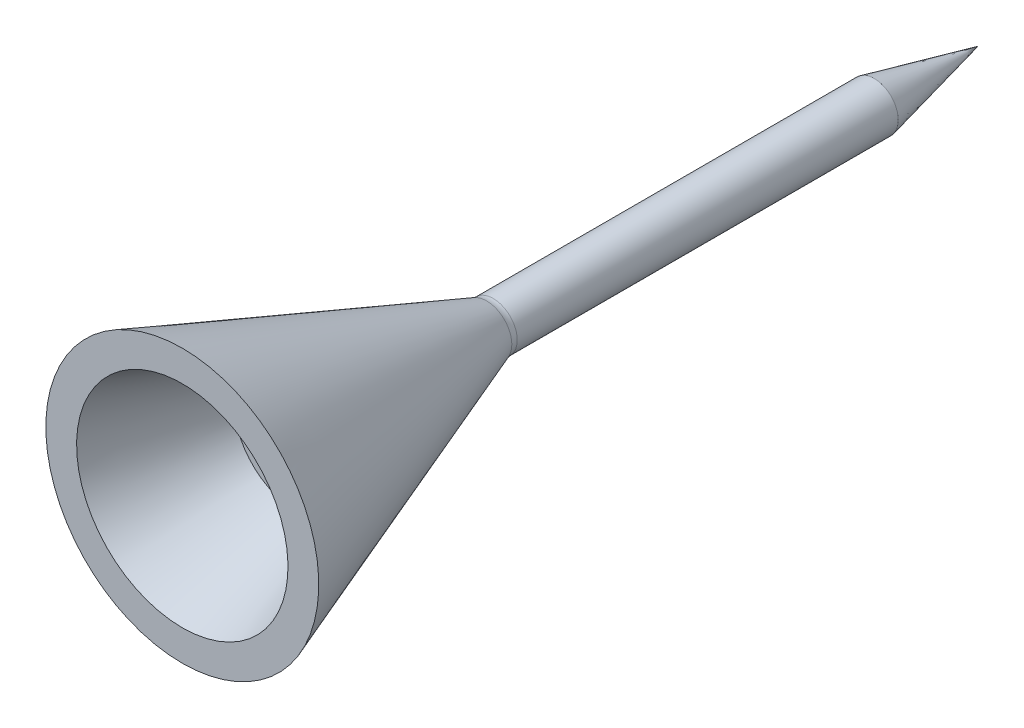
ISO-10303-21;
HEADER;
FILE_DESCRIPTION(('STEP AP214'),'2;1');
FILE_NAME('part.step','',(''),(''),'','','');
FILE_SCHEMA(('AUTOMOTIVE_DESIGN { 1 0 10303 214 1 1 1 1 }'));
ENDSEC;
DATA;
#1=APPLICATION_CONTEXT('core data for automotive mechanical design processes');
#2=APPLICATION_PROTOCOL_DEFINITION('international standard','automotive_design',2000,#1);
#3=PRODUCT_CONTEXT('',#1,'mechanical');
#4=PRODUCT('Part','Part','',(#3));
#5=PRODUCT_RELATED_PRODUCT_CATEGORY('part','',(#4));
#6=PRODUCT_DEFINITION_FORMATION('','',#4);
#7=PRODUCT_DEFINITION_CONTEXT('part definition',#1,'design');
#8=PRODUCT_DEFINITION('design','',#6,#7);
#9=PRODUCT_DEFINITION_SHAPE('','',#8);
#10=(LENGTH_UNIT() NAMED_UNIT(*) SI_UNIT(.MILLI.,.METRE.));
#11=(NAMED_UNIT(*) PLANE_ANGLE_UNIT() SI_UNIT($,.RADIAN.));
#12=(NAMED_UNIT(*) SI_UNIT($,.STERADIAN.) SOLID_ANGLE_UNIT());
#13=UNCERTAINTY_MEASURE_WITH_UNIT(LENGTH_MEASURE(1.E-05),#10,'distance_accuracy_value','');
#14=(GEOMETRIC_REPRESENTATION_CONTEXT(3) GLOBAL_UNCERTAINTY_ASSIGNED_CONTEXT((#13)) GLOBAL_UNIT_ASSIGNED_CONTEXT((#10,
#11,#12)) REPRESENTATION_CONTEXT('',''));
#15=CARTESIAN_POINT('',(0.,0.,0.));
#16=DIRECTION('',(0.,0.,1.));
#17=DIRECTION('',(1.,0.,0.));
#18=AXIS2_PLACEMENT_3D('',#15,#16,#17);
#19=CARTESIAN_POINT('',(0.,0.,10.));
#20=DIRECTION('',(0.,0.,-1.));
#21=DIRECTION('',(0.,1.,0.));
#22=AXIS2_PLACEMENT_3D('',#19,#20,#21);
#23=PLANE('',#22);
#24=CARTESIAN_POINT('',(0.,-1.25000000000001,10.));
#25=DIRECTION('',(0.,0.,1.));
#26=DIRECTION('',(0.,-1.,0.));
#27=AXIS2_PLACEMENT_3D('',#24,#25,#26);
#28=CIRCLE('',#27,3.30625);
#29=CARTESIAN_POINT('',(0.,-4.55625000000001,10.));
#30=VERTEX_POINT('',#29);
#31=EDGE_CURVE('E74',#30,#30,#28,.T.);
#32=ORIENTED_EDGE('',*,*,#31,.T.);
#33=EDGE_LOOP('',(#32));
#34=FACE_BOUND('',#33,.T.);
#35=ADVANCED_FACE('F41',(#34),#23,.F.);
#36=CARTESIAN_POINT('',(0.,-1.25,-20.));
#37=DIRECTION('',(0.,0.,1.));
#38=DIRECTION('',(0.,-1.,0.));
#39=AXIS2_PLACEMENT_3D('',#36,#37,#38);
#40=CONICAL_SURFACE('',#39,1.25,0.227474980472828);
#41=CARTESIAN_POINT('',(0.,-1.25,-25.4));
#42=VERTEX_POINT('',#41);
#43=VERTEX_LOOP('',#42);
#44=FACE_BOUND('',#43,.T.);
#45=CARTESIAN_POINT('',(0.,-1.25,-20.));
#46=DIRECTION('',(0.,0.,1.));
#47=DIRECTION('',(0.,-1.,0.));
#48=AXIS2_PLACEMENT_3D('',#45,#46,#47);
#49=CIRCLE('',#48,1.25);
#50=CARTESIAN_POINT('',(0.,-2.5,-20.));
#51=VERTEX_POINT('',#50);
#52=EDGE_CURVE('E59',#51,#51,#49,.T.);
#53=ORIENTED_EDGE('',*,*,#52,.F.);
#54=EDGE_LOOP('',(#53));
#55=FACE_BOUND('',#54,.T.);
#56=ADVANCED_FACE('F52',(#44,#55),#40,.T.);
#57=CARTESIAN_POINT('',(0.,-1.25000000000001,10.));
#58=DIRECTION('',(0.,0.,1.));
#59=DIRECTION('',(0.,-1.,0.));
#60=AXIS2_PLACEMENT_3D('',#57,#58,#59);
#61=CYLINDRICAL_SURFACE('',#60,1.25);
#62=CARTESIAN_POINT('',(0.,-1.25,-0.17707998945053));
#63=DIRECTION('',(0.,0.,1.));
#64=DIRECTION('',(0.,-1.,0.));
#65=AXIS2_PLACEMENT_3D('',#62,#63,#64);
#66=CIRCLE('',#65,1.25);
#67=CARTESIAN_POINT('',(0.,-2.50000000000001,-0.17707998945053));
#68=VERTEX_POINT('',#67);
#69=EDGE_CURVE('E11',#68,#68,#66,.F.);
#70=ORIENTED_EDGE('',*,*,#69,.T.);
#71=EDGE_LOOP('',(#70));
#72=FACE_BOUND('',#71,.T.);
#73=ORIENTED_EDGE('',*,*,#52,.T.);
#74=EDGE_LOOP('',(#73));
#75=FACE_BOUND('',#74,.T.);
#76=ADVANCED_FACE('F55',(#72,#75),#61,.T.);
#77=CARTESIAN_POINT('',(0.,-1.25000000000001,16.));
#78=DIRECTION('',(0.,0.,1.));
#79=DIRECTION('',(0.,-1.,0.));
#80=AXIS2_PLACEMENT_3D('',#77,#78,#79);
#81=CONICAL_SURFACE('',#80,7.1,0.350526267578669);
#82=CARTESIAN_POINT('',(0.,-1.25,0.166312131901089));
#83=DIRECTION('',(0.,0.,1.));
#84=DIRECTION('',(0.,-1.,0.));
#85=AXIS2_PLACEMENT_3D('',#82,#83,#84);
#86=CIRCLE('',#85,1.31080787322634);
#87=CARTESIAN_POINT('',(0.,-2.56080787322634,0.166312131901089));
#88=VERTEX_POINT('',#87);
#89=EDGE_CURVE('E49',#88,#88,#86,.T.);
#90=CARTESIAN_POINT('',(0.,-1.25000000000001,16.));
#91=DIRECTION('',(0.,0.,1.));
#92=DIRECTION('',(0.,-1.,0.));
#93=AXIS2_PLACEMENT_3D('',#90,#91,#92);
#94=CIRCLE('',#93,7.1);
#95=CARTESIAN_POINT('',(0.,-8.35000000000001,16.));
#96=VERTEX_POINT('',#95);
#97=EDGE_CURVE('E62',#96,#96,#94,.T.);
#98=CARTESIAN_POINT('',(0.,-2.56080787322634,0.166312131901089));
#99=CARTESIAN_POINT('',(0.,-2.62111195788024,0.33124638052712));
#100=CARTESIAN_POINT('',(0.,-2.68141604253413,0.49618062915315));
#101=CARTESIAN_POINT('',(0.,-2.80202421184191,0.82604912640521));
#102=CARTESIAN_POINT('',(0.,-2.86232829649581,0.990983375031241));
#103=CARTESIAN_POINT('',(0.,-2.98293646580359,1.3208518722833));
#104=CARTESIAN_POINT('',(0.,-3.04324055045748,1.48578612090933));
#105=CARTESIAN_POINT('',(0.,-3.16384871976527,1.81565461816139));
#106=CARTESIAN_POINT('',(0.,-3.22415280441916,1.98058886678742));
#107=CARTESIAN_POINT('',(0.,-3.34476097372694,2.31045736403948));
#108=CARTESIAN_POINT('',(0.,-3.40506505838084,2.47539161266551));
#109=CARTESIAN_POINT('',(0.,-3.52567322768862,2.80526010991757));
#110=CARTESIAN_POINT('',(0.,-3.58597731234251,2.9701943585436));
#111=CARTESIAN_POINT('',(0.,-3.7065854816503,3.30006285579567));
#112=CARTESIAN_POINT('',(0.,-3.76688956630419,3.4649971044217));
#113=CARTESIAN_POINT('',(0.,-3.88749773561198,3.79486560167376));
#114=CARTESIAN_POINT('',(0.,-3.94780182026587,3.95979985029979));
#115=CARTESIAN_POINT('',(0.,-4.06840998957365,4.28966834755185));
#116=CARTESIAN_POINT('',(0.,-4.12871407422754,4.45460259617788));
#117=CARTESIAN_POINT('',(0.,-4.24932224353533,4.78447109342994));
#118=CARTESIAN_POINT('',(0.,-4.30962632818922,4.94940534205597));
#119=CARTESIAN_POINT('',(0.,-4.430234497497,5.27927383930803));
#120=CARTESIAN_POINT('',(0.,-4.4905385821509,5.44420808793406));
#121=CARTESIAN_POINT('',(0.,-4.61114675145868,5.77407658518612));
#122=CARTESIAN_POINT('',(0.,-4.67145083611257,5.93901083381215));
#123=CARTESIAN_POINT('',(0.,-4.79205900542036,6.26887933106421));
#124=CARTESIAN_POINT('',(0.,-4.85236309007425,6.43381357969024));
#125=CARTESIAN_POINT('',(0.,-4.97297125938204,6.7636820769423));
#126=CARTESIAN_POINT('',(0.,-5.03327534403593,6.92861632556833));
#127=CARTESIAN_POINT('',(0.,-5.15388351334371,7.25848482282039));
#128=CARTESIAN_POINT('',(0.,-5.21418759799761,7.42341907144642));
#129=CARTESIAN_POINT('',(0.,-5.33479576730539,7.75328756869848));
#130=CARTESIAN_POINT('',(0.,-5.39509985195928,7.91822181732451));
#131=CARTESIAN_POINT('',(0.,-5.51570802126707,8.24809031457657));
#132=CARTESIAN_POINT('',(0.,-5.57601210592096,8.4130245632026));
#133=CARTESIAN_POINT('',(0.,-5.69662027522874,8.74289306045466));
#134=CARTESIAN_POINT('',(0.,-5.75692435988264,8.90782730908069));
#135=CARTESIAN_POINT('',(0.,-5.87753252919042,9.23769580633275));
#136=CARTESIAN_POINT('',(0.,-5.93783661384431,9.40263005495879));
#137=CARTESIAN_POINT('',(0.,-6.0584447831521,9.73249855221085));
#138=CARTESIAN_POINT('',(0.,-6.11874886780599,9.89743280083688));
#139=CARTESIAN_POINT('',(0.,-6.23935703711378,10.2273012980889));
#140=CARTESIAN_POINT('',(0.,-6.29966112176767,10.392235546715));
#141=CARTESIAN_POINT('',(0.,-6.42026929107545,10.722104043967));
#142=CARTESIAN_POINT('',(0.,-6.48057337572934,10.8870382925931));
#143=CARTESIAN_POINT('',(0.,-6.60118154503713,11.2169067898451));
#144=CARTESIAN_POINT('',(0.,-6.66148562969102,11.3818410384711));
#145=CARTESIAN_POINT('',(0.,-6.7820937989988,11.7117095357232));
#146=CARTESIAN_POINT('',(0.,-6.8423978836527,11.8766437843492));
#147=CARTESIAN_POINT('',(0.,-6.96300605296048,12.2065122816013));
#148=CARTESIAN_POINT('',(0.,-7.02331013761437,12.3714465302273));
#149=CARTESIAN_POINT('',(0.,-7.14391830692216,12.7013150274794));
#150=CARTESIAN_POINT('',(0.,-7.20422239157605,12.8662492761054));
#151=CARTESIAN_POINT('',(0.,-7.32483056088384,13.1961177733575));
#152=CARTESIAN_POINT('',(0.,-7.38513464553773,13.3610520219835));
#153=CARTESIAN_POINT('',(0.,-7.50574281484551,13.6909205192356));
#154=CARTESIAN_POINT('',(0.,-7.56604689949941,13.8558547678616));
#155=CARTESIAN_POINT('',(0.,-7.68665506880719,14.1857232651137));
#156=CARTESIAN_POINT('',(0.,-7.74695915346108,14.3506575137397));
#157=CARTESIAN_POINT('',(0.,-7.86756732276887,14.6805260109918));
#158=CARTESIAN_POINT('',(0.,-7.92787140742276,14.8454602596178));
#159=CARTESIAN_POINT('',(0.,-8.04847957673054,15.1753287568698));
#160=CARTESIAN_POINT('',(0.,-8.10878366138444,15.3402630054959));
#161=CARTESIAN_POINT('',(0.,-8.22939183069222,15.6701315027479));
#162=CARTESIAN_POINT('',(0.,-8.28969591534611,15.835065751374));
#163=CARTESIAN_POINT('',(0.,-8.35000000000001,16.));
#164=B_SPLINE_CURVE_WITH_KNOTS('',3,(#98,#99,#100,#101,#102,#103,#104,#105,#106,#107,#108,#109,
#110,#111,#112,#113,#114,#115,#116,#117,#118,#119,#120,#121,#122,#123,#124,#125,#126,#127,#128,
#129,#130,#131,#132,#133,#134,#135,#136,#137,#138,#139,#140,#141,#142,#143,#144,#145,#146,#147,
#148,#149,#150,#151,#152,#153,#154,#155,#156,#157,#158,#159,#160,#161,#162,#163),.UNSPECIFIED.,
.F.,.F.,(4,2,2,2,2,2,2,2,2,2,2,2,2,2,2,2,2,2,2,2,2,2,2,2,2,2,2,2,2,2,2,2,4),(0.,
0.526838685901095,1.05367737180219,1.58051605770329,2.10735474360438,2.63419342950548,
3.16103211540657,3.68787080130767,4.21470948720876,4.74154817310986,5.26838685901095,
5.79522554491205,6.32206423081314,6.84890291671424,7.37574160261533,7.90258028851643,
8.42941897441752,8.95625766031862,9.48309634621971,10.0099350321208,10.5367737180219,
11.063612403923,11.5904510898241,12.1172897757252,12.6441284616263,13.1709671475274,
13.6978058334285,14.2246445193296,14.7514832052307,15.2783218911318,15.8051605770328,
16.3319992629339,16.858837948835),.UNSPECIFIED.);
#165=EDGE_CURVE('BSEAM89',#88,#96,#164,.T.);
#166=ORIENTED_EDGE('',*,*,#89,.T.);
#167=ORIENTED_EDGE('',*,*,#97,.F.);
#168=ORIENTED_EDGE('',*,*,#165,.T.);
#169=ORIENTED_EDGE('',*,*,#165,.F.);
#170=EDGE_LOOP('',(#166,#168,#167,#169));
#171=FACE_BOUND('',#170,.T.);
#172=ADVANCED_FACE('F89',(#171),#81,.T.);
#173=CARTESIAN_POINT('',(0.,0.,16.));
#174=DIRECTION('',(0.,0.,-1.));
#175=DIRECTION('',(0.,1.,0.));
#176=AXIS2_PLACEMENT_3D('',#173,#174,#175);
#177=PLANE('',#176);
#178=CARTESIAN_POINT('',(0.,-1.25000000000001,16.));
#179=DIRECTION('',(0.,0.,1.));
#180=DIRECTION('',(0.,-1.,0.));
#181=AXIS2_PLACEMENT_3D('',#178,#179,#180);
#182=CIRCLE('',#181,5.5);
#183=CARTESIAN_POINT('',(0.,-6.75000000000001,16.));
#184=VERTEX_POINT('',#183);
#185=EDGE_CURVE('E68',#184,#184,#182,.T.);
#186=ORIENTED_EDGE('',*,*,#185,.F.);
#187=EDGE_LOOP('',(#186));
#188=FACE_BOUND('',#187,.T.);
#189=ORIENTED_EDGE('',*,*,#97,.T.);
#190=EDGE_LOOP('',(#189));
#191=FACE_BOUND('',#190,.T.);
#192=ADVANCED_FACE('F83',(#188,#191),#177,.F.);
#193=CARTESIAN_POINT('',(0.,-1.25000000000001,16.));
#194=DIRECTION('',(0.,0.,1.));
#195=DIRECTION('',(0.,-1.,0.));
#196=AXIS2_PLACEMENT_3D('',#193,#194,#195);
#197=CONICAL_SURFACE('',#196,5.5,0.350526267578669);
#198=ORIENTED_EDGE('',*,*,#31,.F.);
#199=EDGE_LOOP('',(#198));
#200=FACE_BOUND('',#199,.T.);
#201=ORIENTED_EDGE('',*,*,#185,.T.);
#202=EDGE_LOOP('',(#201));
#203=FACE_BOUND('',#202,.T.);
#204=ADVANCED_FACE('F80',(#200,#203),#197,.F.);
#205=CARTESIAN_POINT('',(0.,-1.25,-0.17707998945053));
#206=DIRECTION('',(0.,0.,1.));
#207=DIRECTION('',(0.,-1.,0.));
#208=AXIS2_PLACEMENT_3D('',#205,#206,#207);
#209=TOROIDAL_SURFACE('',#208,2.25,1.);
#210=ORIENTED_EDGE('',*,*,#69,.F.);
#211=EDGE_LOOP('',(#210));
#212=FACE_BOUND('',#211,.T.);
#213=ORIENTED_EDGE('',*,*,#89,.F.);
#214=EDGE_LOOP('',(#213));
#215=FACE_BOUND('',#214,.T.);
#216=ADVANCED_FACE('F43',(#212,#215),#209,.F.);
#217=CLOSED_SHELL('',(#35,#56,#76,#172,#192,#204,#216));
#218=MANIFOLD_SOLID_BREP('B2',#217);
#219=ADVANCED_BREP_SHAPE_REPRESENTATION('',(#18,#218),#14);
#220=SHAPE_DEFINITION_REPRESENTATION(#9,#219);
ENDSEC;
END-ISO-10303-21;
